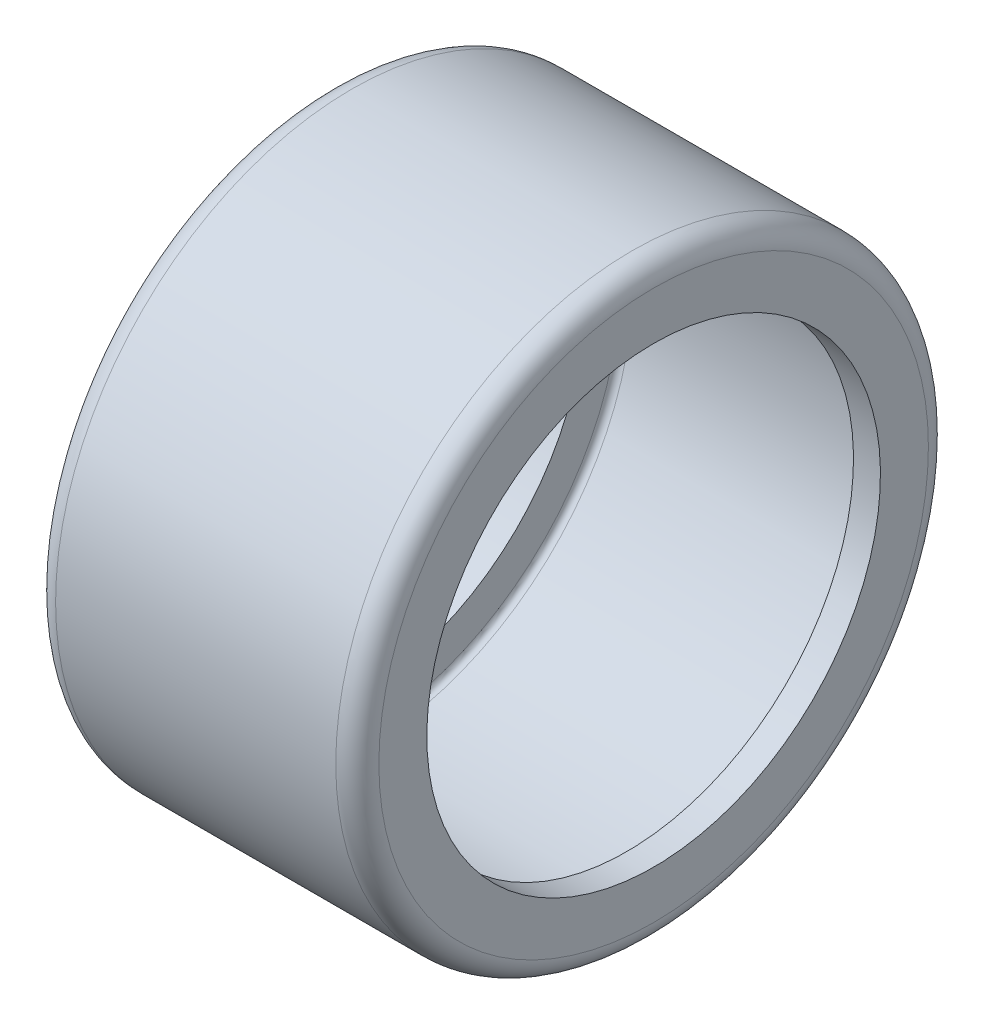
ISO-10303-21;
HEADER;
FILE_DESCRIPTION(('STEP AP214'),'2;1');
FILE_NAME('part.step','',(''),(''),'','','');
FILE_SCHEMA(('AUTOMOTIVE_DESIGN { 1 0 10303 214 1 1 1 1 }'));
ENDSEC;
DATA;
#1=APPLICATION_CONTEXT('core data for automotive mechanical design processes');
#2=APPLICATION_PROTOCOL_DEFINITION('international standard','automotive_design',2000,#1);
#3=PRODUCT_CONTEXT('',#1,'mechanical');
#4=PRODUCT('Part','Part','',(#3));
#5=PRODUCT_RELATED_PRODUCT_CATEGORY('part','',(#4));
#6=PRODUCT_DEFINITION_FORMATION('','',#4);
#7=PRODUCT_DEFINITION_CONTEXT('part definition',#1,'design');
#8=PRODUCT_DEFINITION('design','',#6,#7);
#9=PRODUCT_DEFINITION_SHAPE('','',#8);
#10=(LENGTH_UNIT() NAMED_UNIT(*) SI_UNIT(.MILLI.,.METRE.));
#11=(NAMED_UNIT(*) PLANE_ANGLE_UNIT() SI_UNIT($,.RADIAN.));
#12=(NAMED_UNIT(*) SI_UNIT($,.STERADIAN.) SOLID_ANGLE_UNIT());
#13=UNCERTAINTY_MEASURE_WITH_UNIT(LENGTH_MEASURE(1.E-05),#10,'distance_accuracy_value','');
#14=(GEOMETRIC_REPRESENTATION_CONTEXT(3) GLOBAL_UNCERTAINTY_ASSIGNED_CONTEXT((#13)) GLOBAL_UNIT_ASSIGNED_CONTEXT((#10,
#11,#12)) REPRESENTATION_CONTEXT('',''));
#15=CARTESIAN_POINT('',(0.,0.,0.));
#16=DIRECTION('',(0.,0.,1.));
#17=DIRECTION('',(1.,0.,0.));
#18=AXIS2_PLACEMENT_3D('',#15,#16,#17);
#19=CARTESIAN_POINT('',(11.5,0.,0.));
#20=DIRECTION('',(-1.,0.,0.));
#21=DIRECTION('',(0.,1.,0.));
#22=AXIS2_PLACEMENT_3D('',#19,#20,#21);
#23=CYLINDRICAL_SURFACE('',#22,8.42);
#24=CARTESIAN_POINT('',(12.,0.,0.));
#25=DIRECTION('',(1.,0.,0.));
#26=DIRECTION('',(0.,1.,0.));
#27=AXIS2_PLACEMENT_3D('',#24,#25,#26);
#28=CIRCLE('',#27,8.42);
#29=CARTESIAN_POINT('',(12.,8.42,0.));
#30=VERTEX_POINT('',#29);
#31=EDGE_CURVE('E11',#30,#30,#28,.T.);
#32=ORIENTED_EDGE('',*,*,#31,.T.);
#33=EDGE_LOOP('',(#32));
#34=FACE_BOUND('',#33,.T.);
#35=CARTESIAN_POINT('',(11.,0.,0.));
#36=DIRECTION('',(1.,0.,0.));
#37=DIRECTION('',(0.,1.,0.));
#38=AXIS2_PLACEMENT_3D('',#35,#36,#37);
#39=CIRCLE('',#38,8.42);
#40=CARTESIAN_POINT('',(11.,8.42,0.));
#41=VERTEX_POINT('',#40);
#42=EDGE_CURVE('E76',#41,#41,#39,.T.);
#43=ORIENTED_EDGE('',*,*,#42,.F.);
#44=EDGE_LOOP('',(#43));
#45=FACE_BOUND('',#44,.T.);
#46=ADVANCED_FACE('F16',(#34,#45),#23,.F.);
#47=CARTESIAN_POINT('',(12.,9.31,0.));
#48=DIRECTION('',(1.,0.,0.));
#49=DIRECTION('',(0.,1.,0.));
#50=AXIS2_PLACEMENT_3D('',#47,#48,#49);
#51=PLANE('',#50);
#52=CARTESIAN_POINT('',(12.,0.,0.));
#53=DIRECTION('',(1.,0.,0.));
#54=DIRECTION('',(0.,1.,0.));
#55=AXIS2_PLACEMENT_3D('',#52,#53,#54);
#56=CIRCLE('',#55,10.2);
#57=CARTESIAN_POINT('',(12.,10.2,0.));
#58=VERTEX_POINT('',#57);
#59=EDGE_CURVE('E23',#58,#58,#56,.T.);
#60=ORIENTED_EDGE('',*,*,#59,.T.);
#61=EDGE_LOOP('',(#60));
#62=FACE_BOUND('',#61,.T.);
#63=ORIENTED_EDGE('',*,*,#31,.F.);
#64=EDGE_LOOP('',(#63));
#65=FACE_BOUND('',#64,.T.);
#66=ADVANCED_FACE('F103',(#62,#65),#51,.T.);
#67=CARTESIAN_POINT('',(11.2,0.,0.));
#68=DIRECTION('',(1.,0.,0.));
#69=DIRECTION('',(0.,0.,-1.));
#70=AXIS2_PLACEMENT_3D('',#67,#68,#69);
#71=TOROIDAL_SURFACE('',#70,10.2,0.8);
#72=CARTESIAN_POINT('',(11.2,0.,0.));
#73=DIRECTION('',(1.,0.,0.));
#74=DIRECTION('',(0.,1.,0.));
#75=AXIS2_PLACEMENT_3D('',#72,#73,#74);
#76=CIRCLE('',#75,11.);
#77=CARTESIAN_POINT('',(11.2,11.,0.));
#78=VERTEX_POINT('',#77);
#79=EDGE_CURVE('E79',#78,#78,#76,.T.);
#80=ORIENTED_EDGE('',*,*,#79,.T.);
#81=EDGE_LOOP('',(#80));
#82=FACE_BOUND('',#81,.T.);
#83=ORIENTED_EDGE('',*,*,#59,.F.);
#84=EDGE_LOOP('',(#83));
#85=FACE_BOUND('',#84,.T.);
#86=ADVANCED_FACE('F87',(#82,#85),#71,.T.);
#87=CARTESIAN_POINT('',(6.,0.,0.));
#88=DIRECTION('',(-1.,0.,0.));
#89=DIRECTION('',(0.,1.,0.));
#90=AXIS2_PLACEMENT_3D('',#87,#88,#89);
#91=CYLINDRICAL_SURFACE('',#90,11.);
#92=CARTESIAN_POINT('',(0.8,0.,0.));
#93=DIRECTION('',(1.,0.,0.));
#94=DIRECTION('',(0.,1.,0.));
#95=AXIS2_PLACEMENT_3D('',#92,#93,#94);
#96=CIRCLE('',#95,11.);
#97=CARTESIAN_POINT('',(0.8,11.,0.));
#98=VERTEX_POINT('',#97);
#99=EDGE_CURVE('E77',#98,#98,#96,.T.);
#100=ORIENTED_EDGE('',*,*,#99,.T.);
#101=EDGE_LOOP('',(#100));
#102=FACE_BOUND('',#101,.T.);
#103=ORIENTED_EDGE('',*,*,#79,.F.);
#104=EDGE_LOOP('',(#103));
#105=FACE_BOUND('',#104,.T.);
#106=ADVANCED_FACE('F90',(#102,#105),#91,.T.);
#107=CARTESIAN_POINT('',(0.8,0.,0.));
#108=DIRECTION('',(1.,0.,0.));
#109=DIRECTION('',(0.,0.,-1.));
#110=AXIS2_PLACEMENT_3D('',#107,#108,#109);
#111=TOROIDAL_SURFACE('',#110,10.2,0.8);
#112=CARTESIAN_POINT('',(0.,0.,0.));
#113=DIRECTION('',(1.,0.,0.));
#114=DIRECTION('',(0.,1.,0.));
#115=AXIS2_PLACEMENT_3D('',#112,#113,#114);
#116=CIRCLE('',#115,10.2);
#117=CARTESIAN_POINT('',(0.,10.2,0.));
#118=VERTEX_POINT('',#117);
#119=EDGE_CURVE('E69',#118,#118,#116,.T.);
#120=ORIENTED_EDGE('',*,*,#119,.T.);
#121=EDGE_LOOP('',(#120));
#122=FACE_BOUND('',#121,.T.);
#123=ORIENTED_EDGE('',*,*,#99,.F.);
#124=EDGE_LOOP('',(#123));
#125=FACE_BOUND('',#124,.T.);
#126=ADVANCED_FACE('F92',(#122,#125),#111,.T.);
#127=CARTESIAN_POINT('',(0.,9.31,0.));
#128=DIRECTION('',(-1.,0.,0.));
#129=DIRECTION('',(0.,-1.,0.));
#130=AXIS2_PLACEMENT_3D('',#127,#128,#129);
#131=PLANE('',#130);
#132=CARTESIAN_POINT('',(0.,0.,0.));
#133=DIRECTION('',(1.,0.,0.));
#134=DIRECTION('',(0.,1.,0.));
#135=AXIS2_PLACEMENT_3D('',#132,#133,#134);
#136=CIRCLE('',#135,8.42);
#137=CARTESIAN_POINT('',(0.,8.42,0.));
#138=VERTEX_POINT('',#137);
#139=EDGE_CURVE('E66',#138,#138,#136,.T.);
#140=ORIENTED_EDGE('',*,*,#139,.T.);
#141=EDGE_LOOP('',(#140));
#142=FACE_BOUND('',#141,.T.);
#143=ORIENTED_EDGE('',*,*,#119,.F.);
#144=EDGE_LOOP('',(#143));
#145=FACE_BOUND('',#144,.T.);
#146=ADVANCED_FACE('F100',(#142,#145),#131,.T.);
#147=CARTESIAN_POINT('',(0.5,0.,0.));
#148=DIRECTION('',(-1.,0.,0.));
#149=DIRECTION('',(0.,1.,0.));
#150=AXIS2_PLACEMENT_3D('',#147,#148,#149);
#151=CYLINDRICAL_SURFACE('',#150,8.42);
#152=CARTESIAN_POINT('',(1.,0.,0.));
#153=DIRECTION('',(1.,0.,0.));
#154=DIRECTION('',(0.,1.,0.));
#155=AXIS2_PLACEMENT_3D('',#152,#153,#154);
#156=CIRCLE('',#155,8.42);
#157=CARTESIAN_POINT('',(1.,8.42,0.));
#158=VERTEX_POINT('',#157);
#159=EDGE_CURVE('E62',#158,#158,#156,.T.);
#160=ORIENTED_EDGE('',*,*,#159,.T.);
#161=EDGE_LOOP('',(#160));
#162=FACE_BOUND('',#161,.T.);
#163=ORIENTED_EDGE('',*,*,#139,.F.);
#164=EDGE_LOOP('',(#163));
#165=FACE_BOUND('',#164,.T.);
#166=ADVANCED_FACE('F63',(#162,#165),#151,.F.);
#167=CARTESIAN_POINT('',(1.,9.09,0.));
#168=DIRECTION('',(1.,0.,0.));
#169=DIRECTION('',(0.,1.,0.));
#170=AXIS2_PLACEMENT_3D('',#167,#168,#169);
#171=PLANE('',#170);
#172=CARTESIAN_POINT('',(1.,0.,0.));
#173=DIRECTION('',(1.,0.,0.));
#174=DIRECTION('',(0.,1.,0.));
#175=AXIS2_PLACEMENT_3D('',#172,#173,#174);
#176=CIRCLE('',#175,9.76);
#177=CARTESIAN_POINT('',(1.,9.76,0.));
#178=VERTEX_POINT('',#177);
#179=EDGE_CURVE('E67',#178,#178,#176,.T.);
#180=ORIENTED_EDGE('',*,*,#179,.T.);
#181=EDGE_LOOP('',(#180));
#182=FACE_BOUND('',#181,.T.);
#183=ORIENTED_EDGE('',*,*,#159,.F.);
#184=EDGE_LOOP('',(#183));
#185=FACE_BOUND('',#184,.T.);
#186=ADVANCED_FACE('F133',(#182,#185),#171,.T.);
#187=CARTESIAN_POINT('',(1.24,0.,0.));
#188=DIRECTION('',(1.,0.,0.));
#189=DIRECTION('',(0.,0.,-1.));
#190=AXIS2_PLACEMENT_3D('',#187,#188,#189);
#191=TOROIDAL_SURFACE('',#190,9.76,0.24);
#192=CARTESIAN_POINT('',(1.24,0.,0.));
#193=DIRECTION('',(1.,0.,0.));
#194=DIRECTION('',(0.,1.,0.));
#195=AXIS2_PLACEMENT_3D('',#192,#193,#194);
#196=CIRCLE('',#195,10.);
#197=CARTESIAN_POINT('',(1.24,10.,0.));
#198=VERTEX_POINT('',#197);
#199=EDGE_CURVE('E71',#198,#198,#196,.T.);
#200=ORIENTED_EDGE('',*,*,#199,.T.);
#201=EDGE_LOOP('',(#200));
#202=FACE_BOUND('',#201,.T.);
#203=ORIENTED_EDGE('',*,*,#179,.F.);
#204=EDGE_LOOP('',(#203));
#205=FACE_BOUND('',#204,.T.);
#206=ADVANCED_FACE('F127',(#202,#205),#191,.F.);
#207=CARTESIAN_POINT('',(6.,0.,0.));
#208=DIRECTION('',(-1.,0.,0.));
#209=DIRECTION('',(0.,1.,0.));
#210=AXIS2_PLACEMENT_3D('',#207,#208,#209);
#211=CYLINDRICAL_SURFACE('',#210,10.);
#212=CARTESIAN_POINT('',(10.76,0.,0.));
#213=DIRECTION('',(1.,0.,0.));
#214=DIRECTION('',(0.,1.,0.));
#215=AXIS2_PLACEMENT_3D('',#212,#213,#214);
#216=CIRCLE('',#215,10.);
#217=CARTESIAN_POINT('',(10.76,10.,0.));
#218=VERTEX_POINT('',#217);
#219=EDGE_CURVE('E81',#218,#218,#216,.T.);
#220=ORIENTED_EDGE('',*,*,#219,.T.);
#221=EDGE_LOOP('',(#220));
#222=FACE_BOUND('',#221,.T.);
#223=ORIENTED_EDGE('',*,*,#199,.F.);
#224=EDGE_LOOP('',(#223));
#225=FACE_BOUND('',#224,.T.);
#226=ADVANCED_FACE('F121',(#222,#225),#211,.F.);
#227=CARTESIAN_POINT('',(10.76,0.,0.));
#228=DIRECTION('',(1.,0.,0.));
#229=DIRECTION('',(0.,0.,-1.));
#230=AXIS2_PLACEMENT_3D('',#227,#228,#229);
#231=TOROIDAL_SURFACE('',#230,9.76,0.24);
#232=CARTESIAN_POINT('',(11.,0.,0.));
#233=DIRECTION('',(1.,0.,0.));
#234=DIRECTION('',(0.,1.,0.));
#235=AXIS2_PLACEMENT_3D('',#232,#233,#234);
#236=CIRCLE('',#235,9.76);
#237=CARTESIAN_POINT('',(11.,9.76,0.));
#238=VERTEX_POINT('',#237);
#239=EDGE_CURVE('E74',#238,#238,#236,.T.);
#240=ORIENTED_EDGE('',*,*,#239,.T.);
#241=EDGE_LOOP('',(#240));
#242=FACE_BOUND('',#241,.T.);
#243=ORIENTED_EDGE('',*,*,#219,.F.);
#244=EDGE_LOOP('',(#243));
#245=FACE_BOUND('',#244,.T.);
#246=ADVANCED_FACE('F115',(#242,#245),#231,.F.);
#247=CARTESIAN_POINT('',(11.,9.09,0.));
#248=DIRECTION('',(-1.,0.,0.));
#249=DIRECTION('',(0.,-1.,0.));
#250=AXIS2_PLACEMENT_3D('',#247,#248,#249);
#251=PLANE('',#250);
#252=ORIENTED_EDGE('',*,*,#42,.T.);
#253=EDGE_LOOP('',(#252));
#254=FACE_BOUND('',#253,.T.);
#255=ORIENTED_EDGE('',*,*,#239,.F.);
#256=EDGE_LOOP('',(#255));
#257=FACE_BOUND('',#256,.T.);
#258=ADVANCED_FACE('F112',(#254,#257),#251,.T.);
#259=CLOSED_SHELL('',(#46,#66,#86,#106,#126,#146,#166,#186,#206,#226,#246,#258));
#260=MANIFOLD_SOLID_BREP('B1',#259);
#261=ADVANCED_BREP_SHAPE_REPRESENTATION('',(#18,#260),#14);
#262=SHAPE_DEFINITION_REPRESENTATION(#9,#261);
ENDSEC;
END-ISO-10303-21;
